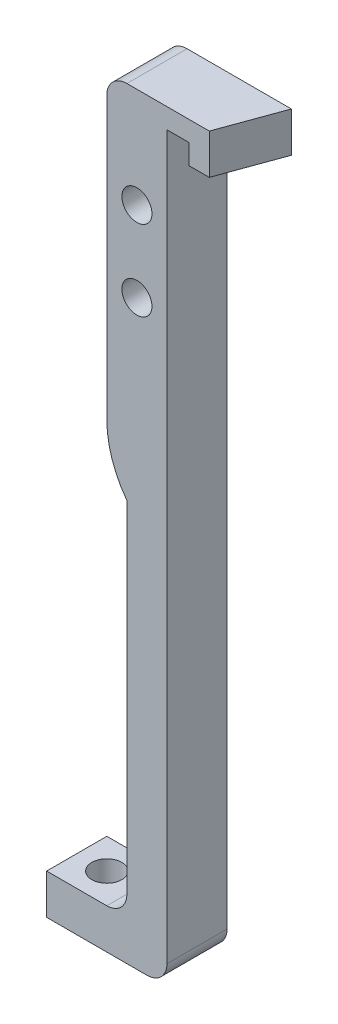
ISO-10303-21;
HEADER;
FILE_DESCRIPTION(('STEP AP214'),'2;1');
FILE_NAME('part.step','',(''),(''),'','','');
FILE_SCHEMA(('AUTOMOTIVE_DESIGN { 1 0 10303 214 1 1 1 1 }'));
ENDSEC;
DATA;
#1=APPLICATION_CONTEXT('core data for automotive mechanical design processes');
#2=APPLICATION_PROTOCOL_DEFINITION('international standard','automotive_design',2000,#1);
#3=PRODUCT_CONTEXT('',#1,'mechanical');
#4=PRODUCT('Part','Part','',(#3));
#5=PRODUCT_RELATED_PRODUCT_CATEGORY('part','',(#4));
#6=PRODUCT_DEFINITION_FORMATION('','',#4);
#7=PRODUCT_DEFINITION_CONTEXT('part definition',#1,'design');
#8=PRODUCT_DEFINITION('design','',#6,#7);
#9=PRODUCT_DEFINITION_SHAPE('','',#8);
#10=(LENGTH_UNIT() NAMED_UNIT(*) SI_UNIT(.MILLI.,.METRE.));
#11=(NAMED_UNIT(*) PLANE_ANGLE_UNIT() SI_UNIT($,.RADIAN.));
#12=(NAMED_UNIT(*) SI_UNIT($,.STERADIAN.) SOLID_ANGLE_UNIT());
#13=UNCERTAINTY_MEASURE_WITH_UNIT(LENGTH_MEASURE(1.E-05),#10,'distance_accuracy_value','');
#14=(GEOMETRIC_REPRESENTATION_CONTEXT(3) GLOBAL_UNCERTAINTY_ASSIGNED_CONTEXT((#13)) GLOBAL_UNIT_ASSIGNED_CONTEXT((#10,
#11,#12)) REPRESENTATION_CONTEXT('',''));
#15=CARTESIAN_POINT('',(0.,0.,0.));
#16=DIRECTION('',(0.,0.,1.));
#17=DIRECTION('',(1.,0.,0.));
#18=AXIS2_PLACEMENT_3D('',#15,#16,#17);
#19=CARTESIAN_POINT('',(15.748,93.98,-15.24));
#20=DIRECTION('',(0.,1.,0.));
#21=DIRECTION('',(0.,0.,-1.));
#22=AXIS2_PLACEMENT_3D('',#19,#20,#21);
#23=PLANE('',#22);
#24=DIRECTION('',(-0.342020143325663,0.,0.93969262078591));
#25=VECTOR('',#24,1.);
#26=CARTESIAN_POINT('',(10.4345468148915,93.98,-7.62));
#27=LINE('',#26,#25);
#28=CARTESIAN_POINT('',(13.2079999999999,93.98,-15.24));
#29=VERTEX_POINT('',#28);
#30=CARTESIAN_POINT('',(10.4345468148915,93.98,-7.62));
#31=VERTEX_POINT('',#30);
#32=EDGE_CURVE('E183',#29,#31,#27,.T.);
#33=ORIENTED_EDGE('',*,*,#32,.T.);
#34=DIRECTION('',(-1.,0.,0.));
#35=VECTOR('',#34,1.);
#36=CARTESIAN_POINT('',(15.748,93.98,-7.62));
#37=LINE('',#36,#35);
#38=CARTESIAN_POINT('',(7.62,93.98,-7.62));
#39=VERTEX_POINT('',#38);
#40=EDGE_CURVE('E207',#31,#39,#37,.T.);
#41=ORIENTED_EDGE('',*,*,#40,.T.);
#42=DIRECTION('',(0.,0.,1.));
#43=VECTOR('',#42,1.);
#44=CARTESIAN_POINT('',(7.62,93.98,-15.24));
#45=LINE('',#44,#43);
#46=CARTESIAN_POINT('',(7.62,93.9799999999999,-15.24));
#47=VERTEX_POINT('',#46);
#48=EDGE_CURVE('E203',#47,#39,#45,.T.);
#49=ORIENTED_EDGE('',*,*,#48,.F.);
#50=DIRECTION('',(-1.,0.,0.));
#51=VECTOR('',#50,1.);
#52=CARTESIAN_POINT('',(15.748,93.98,-15.24));
#53=LINE('',#52,#51);
#54=EDGE_CURVE('E225',#29,#47,#53,.T.);
#55=ORIENTED_EDGE('',*,*,#54,.F.);
#56=EDGE_LOOP('',(#33,#41,#49,#55));
#57=FACE_BOUND('',#56,.T.);
#58=ADVANCED_FACE('F35',(#57),#23,.F.);
#59=CARTESIAN_POINT('',(7.62,0.,-15.24));
#60=DIRECTION('',(-1.,0.,0.));
#61=DIRECTION('',(0.,0.,-1.));
#62=AXIS2_PLACEMENT_3D('',#59,#60,#61);
#63=PLANE('',#62);
#64=DIRECTION('',(0.,-1.,0.));
#65=VECTOR('',#64,1.);
#66=CARTESIAN_POINT('',(7.62,0.,-15.24));
#67=LINE('',#66,#65);
#68=CARTESIAN_POINT('',(7.62,2.54,-15.24));
#69=VERTEX_POINT('',#68);
#70=EDGE_CURVE('E216',#47,#69,#67,.T.);
#71=ORIENTED_EDGE('',*,*,#70,.F.);
#72=ORIENTED_EDGE('',*,*,#48,.T.);
#73=DIRECTION('',(0.,1.,0.));
#74=VECTOR('',#73,1.);
#75=CARTESIAN_POINT('',(7.62,0.,-7.62));
#76=LINE('',#75,#74);
#77=CARTESIAN_POINT('',(7.62,2.54,-7.62));
#78=VERTEX_POINT('',#77);
#79=EDGE_CURVE('E243',#78,#39,#76,.T.);
#80=ORIENTED_EDGE('',*,*,#79,.F.);
#81=DIRECTION('',(0.,0.,1.));
#82=VECTOR('',#81,1.);
#83=CARTESIAN_POINT('',(7.62,2.54,-15.24));
#84=LINE('',#83,#82);
#85=EDGE_CURVE('E166',#69,#78,#84,.T.);
#86=ORIENTED_EDGE('',*,*,#85,.F.);
#87=EDGE_LOOP('',(#71,#72,#80,#86));
#88=FACE_BOUND('',#87,.T.);
#89=ADVANCED_FACE('F313',(#88),#63,.F.);
#90=CARTESIAN_POINT('',(7.62,0.,-15.24));
#91=DIRECTION('',(0.,0.,1.));
#92=DIRECTION('',(-1.,0.,0.));
#93=AXIS2_PLACEMENT_3D('',#90,#91,#92);
#94=PLANE('',#93);
#95=CARTESIAN_POINT('',(3.81,73.66,-15.24));
#96=DIRECTION('',(0.,0.,1.));
#97=DIRECTION('',(1.,0.,0.));
#98=AXIS2_PLACEMENT_3D('',#95,#96,#97);
#99=CIRCLE('',#98,1.90500000000001);
#100=CARTESIAN_POINT('',(5.71500000000001,73.66,-15.24));
#101=VERTEX_POINT('',#100);
#102=EDGE_CURVE('E283',#101,#101,#99,.T.);
#103=ORIENTED_EDGE('',*,*,#102,.T.);
#104=EDGE_LOOP('',(#103));
#105=FACE_BOUND('',#104,.T.);
#106=CARTESIAN_POINT('',(3.81,83.82,-15.24));
#107=DIRECTION('',(0.,0.,1.));
#108=DIRECTION('',(1.,0.,0.));
#109=AXIS2_PLACEMENT_3D('',#106,#107,#108);
#110=CIRCLE('',#109,1.90500000000001);
#111=CARTESIAN_POINT('',(5.71500000000001,83.82,-15.24));
#112=VERTEX_POINT('',#111);
#113=EDGE_CURVE('E276',#112,#112,#110,.T.);
#114=ORIENTED_EDGE('',*,*,#113,.T.);
#115=EDGE_LOOP('',(#114));
#116=FACE_BOUND('',#115,.T.);
#117=DIRECTION('',(-1.,0.,0.));
#118=VECTOR('',#117,1.);
#119=CARTESIAN_POINT('',(7.62,0.,-15.24));
#120=LINE('',#119,#118);
#121=CARTESIAN_POINT('',(5.08,0.,-15.24));
#122=VERTEX_POINT('',#121);
#123=CARTESIAN_POINT('',(-7.62,0.,-15.24));
#124=VERTEX_POINT('',#123);
#125=EDGE_CURVE('E249',#122,#124,#120,.T.);
#126=ORIENTED_EDGE('',*,*,#125,.T.);
#127=DIRECTION('',(0.,1.,0.));
#128=VECTOR('',#127,1.);
#129=CARTESIAN_POINT('',(-7.62,0.,-15.24));
#130=LINE('',#129,#128);
#131=CARTESIAN_POINT('',(-7.62,5.08,-15.24));
#132=VERTEX_POINT('',#131);
#133=EDGE_CURVE('E210',#124,#132,#130,.T.);
#134=ORIENTED_EDGE('',*,*,#133,.T.);
#135=DIRECTION('',(1.,0.,0.));
#136=VECTOR('',#135,1.);
#137=CARTESIAN_POINT('',(-7.62,5.08,-15.24));
#138=LINE('',#137,#136);
#139=CARTESIAN_POINT('',(0.,5.08,-15.24));
#140=VERTEX_POINT('',#139);
#141=EDGE_CURVE('E253',#132,#140,#138,.T.);
#142=ORIENTED_EDGE('',*,*,#141,.T.);
#143=CARTESIAN_POINT('',(0.,7.62,-15.24));
#144=DIRECTION('',(0.,0.,-1.));
#145=DIRECTION('',(-1.,0.,0.));
#146=AXIS2_PLACEMENT_3D('',#143,#144,#145);
#147=CIRCLE('',#146,2.54);
#148=CARTESIAN_POINT('',(2.54,7.62,-15.24));
#149=VERTEX_POINT('',#148);
#150=EDGE_CURVE('E44',#149,#140,#147,.T.);
#151=ORIENTED_EDGE('',*,*,#150,.F.);
#152=DIRECTION('',(0.,1.,0.));
#153=VECTOR('',#152,1.);
#154=CARTESIAN_POINT('',(2.54,5.08,-15.24));
#155=LINE('',#154,#153);
#156=CARTESIAN_POINT('',(2.54,50.8,-15.24));
#157=VERTEX_POINT('',#156);
#158=EDGE_CURVE('E150',#149,#157,#155,.T.);
#159=ORIENTED_EDGE('',*,*,#158,.T.);
#160=CARTESIAN_POINT('',(12.7,58.42,-15.24));
#161=DIRECTION('',(0.,0.,-1.));
#162=DIRECTION('',(-1.,0.,0.));
#163=AXIS2_PLACEMENT_3D('',#160,#161,#162);
#164=CIRCLE('',#163,12.7);
#165=CARTESIAN_POINT('',(0.,58.42,-15.24));
#166=VERTEX_POINT('',#165);
#167=EDGE_CURVE('E160',#166,#157,#164,.F.);
#168=ORIENTED_EDGE('',*,*,#167,.F.);
#169=DIRECTION('',(0.,-1.,0.));
#170=VECTOR('',#169,1.);
#171=CARTESIAN_POINT('',(0.,0.,-15.24));
#172=LINE('',#171,#170);
#173=CARTESIAN_POINT('',(0.,93.98,-15.24));
#174=VERTEX_POINT('',#173);
#175=EDGE_CURVE('E232',#174,#166,#172,.T.);
#176=ORIENTED_EDGE('',*,*,#175,.F.);
#177=CARTESIAN_POINT('',(2.54,93.98,-15.24));
#178=DIRECTION('',(0.,0.,-1.));
#179=DIRECTION('',(-1.,0.,0.));
#180=AXIS2_PLACEMENT_3D('',#177,#178,#179);
#181=CIRCLE('',#180,2.54);
#182=CARTESIAN_POINT('',(2.54,96.52,-15.24));
#183=VERTEX_POINT('',#182);
#184=EDGE_CURVE('E265',#183,#174,#181,.F.);
#185=ORIENTED_EDGE('',*,*,#184,.F.);
#186=DIRECTION('',(-1.,0.,0.));
#187=VECTOR('',#186,1.);
#188=CARTESIAN_POINT('',(7.62,96.52,-15.24));
#189=LINE('',#188,#187);
#190=CARTESIAN_POINT('',(15.748,96.52,-15.24));
#191=VERTEX_POINT('',#190);
#192=EDGE_CURVE('E240',#191,#183,#189,.T.);
#193=ORIENTED_EDGE('',*,*,#192,.F.);
#194=DIRECTION('',(0.,-1.,0.));
#195=VECTOR('',#194,1.);
#196=CARTESIAN_POINT('',(15.748,96.52,-15.24));
#197=LINE('',#196,#195);
#198=CARTESIAN_POINT('',(15.748,91.44,-15.24));
#199=VERTEX_POINT('',#198);
#200=EDGE_CURVE('E204',#191,#199,#197,.T.);
#201=ORIENTED_EDGE('',*,*,#200,.T.);
#202=DIRECTION('',(-1.,0.,0.));
#203=VECTOR('',#202,1.);
#204=CARTESIAN_POINT('',(15.748,91.44,-15.24));
#205=LINE('',#204,#203);
#206=CARTESIAN_POINT('',(13.2079999999999,91.44,-15.24));
#207=VERTEX_POINT('',#206);
#208=EDGE_CURVE('E184',#199,#207,#205,.T.);
#209=ORIENTED_EDGE('',*,*,#208,.T.);
#210=DIRECTION('',(0.,1.,0.));
#211=VECTOR('',#210,1.);
#212=CARTESIAN_POINT('',(13.2079999999999,91.44,-15.24));
#213=LINE('',#212,#211);
#214=EDGE_CURVE('E201',#207,#29,#213,.T.);
#215=ORIENTED_EDGE('',*,*,#214,.T.);
#216=ORIENTED_EDGE('',*,*,#54,.T.);
#217=ORIENTED_EDGE('',*,*,#70,.T.);
#218=CARTESIAN_POINT('',(5.08,2.54,-15.24));
#219=DIRECTION('',(0.,0.,-1.));
#220=DIRECTION('',(-1.,0.,0.));
#221=AXIS2_PLACEMENT_3D('',#218,#219,#220);
#222=CIRCLE('',#221,2.54);
#223=EDGE_CURVE('E267',#122,#69,#222,.F.);
#224=ORIENTED_EDGE('',*,*,#223,.F.);
#225=EDGE_LOOP('',(#126,#134,#142,#151,#159,#168,#176,#185,#193,#201,#209,#215,#216,#217,#224));
#226=FACE_BOUND('',#225,.T.);
#227=ADVANCED_FACE('F169',(#105,#116,#226),#94,.F.);
#228=CARTESIAN_POINT('',(7.62,0.,-15.24));
#229=DIRECTION('',(0.,1.,0.));
#230=DIRECTION('',(0.,0.,-1.));
#231=AXIS2_PLACEMENT_3D('',#228,#229,#230);
#232=PLANE('',#231);
#233=CARTESIAN_POINT('',(-3.81,0.,-11.43));
#234=DIRECTION('',(0.,-1.,0.));
#235=DIRECTION('',(0.,0.,-1.));
#236=AXIS2_PLACEMENT_3D('',#233,#234,#235);
#237=CIRCLE('',#236,1.89865);
#238=CARTESIAN_POINT('',(-3.81,0.,-13.32865));
#239=VERTEX_POINT('',#238);
#240=EDGE_CURVE('E180',#239,#239,#237,.T.);
#241=ORIENTED_EDGE('',*,*,#240,.F.);
#242=EDGE_LOOP('',(#241));
#243=FACE_BOUND('',#242,.T.);
#244=DIRECTION('',(-1.,0.,0.));
#245=VECTOR('',#244,1.);
#246=CARTESIAN_POINT('',(7.62,0.,-7.62));
#247=LINE('',#246,#245);
#248=CARTESIAN_POINT('',(5.08,0.,-7.62));
#249=VERTEX_POINT('',#248);
#250=CARTESIAN_POINT('',(-7.62,0.,-7.62));
#251=VERTEX_POINT('',#250);
#252=EDGE_CURVE('E246',#249,#251,#247,.T.);
#253=ORIENTED_EDGE('',*,*,#252,.T.);
#254=DIRECTION('',(0.,0.,-1.));
#255=VECTOR('',#254,1.);
#256=CARTESIAN_POINT('',(-7.62,0.,-15.24));
#257=LINE('',#256,#255);
#258=EDGE_CURVE('E254',#251,#124,#257,.T.);
#259=ORIENTED_EDGE('',*,*,#258,.T.);
#260=ORIENTED_EDGE('',*,*,#125,.F.);
#261=DIRECTION('',(0.,0.,1.));
#262=VECTOR('',#261,1.);
#263=CARTESIAN_POINT('',(5.08,0.,-15.24));
#264=LINE('',#263,#262);
#265=EDGE_CURVE('E263',#249,#122,#264,.F.);
#266=ORIENTED_EDGE('',*,*,#265,.F.);
#267=EDGE_LOOP('',(#253,#259,#260,#266));
#268=FACE_BOUND('',#267,.T.);
#269=ADVANCED_FACE('F300',(#243,#268),#232,.F.);
#270=CARTESIAN_POINT('',(7.62,0.,-7.62));
#271=DIRECTION('',(0.,0.,-1.));
#272=DIRECTION('',(1.,0.,0.));
#273=AXIS2_PLACEMENT_3D('',#270,#271,#272);
#274=PLANE('',#273);
#275=CARTESIAN_POINT('',(3.81,73.66,-7.62));
#276=DIRECTION('',(0.,0.,1.));
#277=DIRECTION('',(1.,0.,0.));
#278=AXIS2_PLACEMENT_3D('',#275,#276,#277);
#279=CIRCLE('',#278,1.90500000000001);
#280=CARTESIAN_POINT('',(5.71500000000001,73.66,-7.62));
#281=VERTEX_POINT('',#280);
#282=EDGE_CURVE('E39',#281,#281,#279,.T.);
#283=ORIENTED_EDGE('',*,*,#282,.F.);
#284=EDGE_LOOP('',(#283));
#285=FACE_BOUND('',#284,.T.);
#286=CARTESIAN_POINT('',(3.81,83.82,-7.62));
#287=DIRECTION('',(0.,0.,1.));
#288=DIRECTION('',(1.,0.,0.));
#289=AXIS2_PLACEMENT_3D('',#286,#287,#288);
#290=CIRCLE('',#289,1.90500000000001);
#291=CARTESIAN_POINT('',(5.71500000000001,83.82,-7.62));
#292=VERTEX_POINT('',#291);
#293=EDGE_CURVE('E172',#292,#292,#290,.T.);
#294=ORIENTED_EDGE('',*,*,#293,.F.);
#295=EDGE_LOOP('',(#294));
#296=FACE_BOUND('',#295,.T.);
#297=ORIENTED_EDGE('',*,*,#79,.T.);
#298=ORIENTED_EDGE('',*,*,#40,.F.);
#299=DIRECTION('',(0.,1.,0.));
#300=VECTOR('',#299,1.);
#301=CARTESIAN_POINT('',(10.4345468148915,91.44,-7.62));
#302=LINE('',#301,#300);
#303=CARTESIAN_POINT('',(10.4345468148915,91.44,-7.62));
#304=VERTEX_POINT('',#303);
#305=EDGE_CURVE('E199',#304,#31,#302,.T.);
#306=ORIENTED_EDGE('',*,*,#305,.F.);
#307=DIRECTION('',(1.,0.,0.));
#308=VECTOR('',#307,1.);
#309=CARTESIAN_POINT('',(10.4345468148915,91.44,-7.62));
#310=LINE('',#309,#308);
#311=CARTESIAN_POINT('',(12.9745468148915,91.44,-7.62));
#312=VERTEX_POINT('',#311);
#313=EDGE_CURVE('E189',#304,#312,#310,.T.);
#314=ORIENTED_EDGE('',*,*,#313,.T.);
#315=DIRECTION('',(0.,1.,0.));
#316=VECTOR('',#315,1.);
#317=CARTESIAN_POINT('',(12.9745468148915,91.44,-7.62));
#318=LINE('',#317,#316);
#319=CARTESIAN_POINT('',(12.9745468148915,96.52,-7.62));
#320=VERTEX_POINT('',#319);
#321=EDGE_CURVE('E194',#312,#320,#318,.T.);
#322=ORIENTED_EDGE('',*,*,#321,.T.);
#323=DIRECTION('',(-1.,0.,0.));
#324=VECTOR('',#323,1.);
#325=CARTESIAN_POINT('',(7.62,96.52,-7.62));
#326=LINE('',#325,#324);
#327=CARTESIAN_POINT('',(2.54,96.52,-7.62));
#328=VERTEX_POINT('',#327);
#329=EDGE_CURVE('E242',#320,#328,#326,.T.);
#330=ORIENTED_EDGE('',*,*,#329,.T.);
#331=CARTESIAN_POINT('',(2.54,93.98,-7.62));
#332=DIRECTION('',(0.,0.,1.));
#333=DIRECTION('',(1.,0.,0.));
#334=AXIS2_PLACEMENT_3D('',#331,#332,#333);
#335=CIRCLE('',#334,2.54);
#336=CARTESIAN_POINT('',(0.,93.98,-7.62));
#337=VERTEX_POINT('',#336);
#338=EDGE_CURVE('E334',#337,#328,#335,.F.);
#339=ORIENTED_EDGE('',*,*,#338,.F.);
#340=DIRECTION('',(0.,1.,0.));
#341=VECTOR('',#340,1.);
#342=CARTESIAN_POINT('',(0.,0.,-7.62));
#343=LINE('',#342,#341);
#344=CARTESIAN_POINT('',(0.,58.42,-7.62));
#345=VERTEX_POINT('',#344);
#346=EDGE_CURVE('E228',#345,#337,#343,.T.);
#347=ORIENTED_EDGE('',*,*,#346,.F.);
#348=CARTESIAN_POINT('',(12.7,58.42,-7.62));
#349=DIRECTION('',(0.,0.,1.));
#350=DIRECTION('',(1.,0.,0.));
#351=AXIS2_PLACEMENT_3D('',#348,#349,#350);
#352=CIRCLE('',#351,12.7);
#353=CARTESIAN_POINT('',(2.54,50.8,-7.62));
#354=VERTEX_POINT('',#353);
#355=EDGE_CURVE('E233',#354,#345,#352,.F.);
#356=ORIENTED_EDGE('',*,*,#355,.F.);
#357=DIRECTION('',(0.,-1.,0.));
#358=VECTOR('',#357,1.);
#359=CARTESIAN_POINT('',(2.54,5.08,-7.62));
#360=LINE('',#359,#358);
#361=CARTESIAN_POINT('',(2.54,7.62,-7.62));
#362=VERTEX_POINT('',#361);
#363=EDGE_CURVE('E153',#354,#362,#360,.T.);
#364=ORIENTED_EDGE('',*,*,#363,.T.);
#365=CARTESIAN_POINT('',(0.,7.62,-7.62));
#366=DIRECTION('',(0.,0.,1.));
#367=DIRECTION('',(1.,0.,0.));
#368=AXIS2_PLACEMENT_3D('',#365,#366,#367);
#369=CIRCLE('',#368,2.54);
#370=CARTESIAN_POINT('',(0.,5.08,-7.62));
#371=VERTEX_POINT('',#370);
#372=EDGE_CURVE('E11',#371,#362,#369,.T.);
#373=ORIENTED_EDGE('',*,*,#372,.F.);
#374=DIRECTION('',(1.,0.,0.));
#375=VECTOR('',#374,1.);
#376=CARTESIAN_POINT('',(-7.62,5.08,-7.62));
#377=LINE('',#376,#375);
#378=CARTESIAN_POINT('',(-7.62,5.08,-7.62));
#379=VERTEX_POINT('',#378);
#380=EDGE_CURVE('E251',#379,#371,#377,.T.);
#381=ORIENTED_EDGE('',*,*,#380,.F.);
#382=DIRECTION('',(0.,-1.,0.));
#383=VECTOR('',#382,1.);
#384=CARTESIAN_POINT('',(-7.62,0.,-7.62));
#385=LINE('',#384,#383);
#386=EDGE_CURVE('E341',#379,#251,#385,.T.);
#387=ORIENTED_EDGE('',*,*,#386,.T.);
#388=ORIENTED_EDGE('',*,*,#252,.F.);
#389=CARTESIAN_POINT('',(5.08,2.54,-7.62));
#390=DIRECTION('',(0.,0.,1.));
#391=DIRECTION('',(1.,0.,0.));
#392=AXIS2_PLACEMENT_3D('',#389,#390,#391);
#393=CIRCLE('',#392,2.54);
#394=EDGE_CURVE('E307',#78,#249,#393,.F.);
#395=ORIENTED_EDGE('',*,*,#394,.F.);
#396=EDGE_LOOP('',(#297,#298,#306,#314,#322,#330,#339,#347,#356,#364,#373,#381,#387,#388,#395));
#397=FACE_BOUND('',#396,.T.);
#398=ADVANCED_FACE('F296',(#285,#296,#397),#274,.F.);
#399=CARTESIAN_POINT('',(7.62,96.52,-15.24));
#400=DIRECTION('',(0.,-1.,0.));
#401=DIRECTION('',(0.,0.,1.));
#402=AXIS2_PLACEMENT_3D('',#399,#400,#401);
#403=PLANE('',#402);
#404=ORIENTED_EDGE('',*,*,#329,.F.);
#405=DIRECTION('',(-0.342020143325669,0.,0.939692620785908));
#406=VECTOR('',#405,1.);
#407=CARTESIAN_POINT('',(12.9745468148915,96.52,-7.62));
#408=LINE('',#407,#406);
#409=EDGE_CURVE('E157',#191,#320,#408,.T.);
#410=ORIENTED_EDGE('',*,*,#409,.F.);
#411=ORIENTED_EDGE('',*,*,#192,.T.);
#412=DIRECTION('',(0.,0.,-1.));
#413=VECTOR('',#412,1.);
#414=CARTESIAN_POINT('',(2.54,96.52,-15.24));
#415=LINE('',#414,#413);
#416=EDGE_CURVE('E52',#328,#183,#415,.T.);
#417=ORIENTED_EDGE('',*,*,#416,.F.);
#418=EDGE_LOOP('',(#404,#410,#411,#417));
#419=FACE_BOUND('',#418,.T.);
#420=ADVANCED_FACE('F299',(#419),#403,.F.);
#421=CARTESIAN_POINT('',(0.,0.,-15.24));
#422=DIRECTION('',(-1.,0.,0.));
#423=DIRECTION('',(0.,0.,-1.));
#424=AXIS2_PLACEMENT_3D('',#421,#422,#423);
#425=PLANE('',#424);
#426=ORIENTED_EDGE('',*,*,#175,.T.);
#427=DIRECTION('',(0.,0.,-1.));
#428=VECTOR('',#427,1.);
#429=CARTESIAN_POINT('',(0.,58.42,-15.24));
#430=LINE('',#429,#428);
#431=EDGE_CURVE('E162',#345,#166,#430,.T.);
#432=ORIENTED_EDGE('',*,*,#431,.F.);
#433=ORIENTED_EDGE('',*,*,#346,.T.);
#434=DIRECTION('',(0.,0.,-1.));
#435=VECTOR('',#434,1.);
#436=CARTESIAN_POINT('',(0.,93.98,-7.62));
#437=LINE('',#436,#435);
#438=EDGE_CURVE('E270',#174,#337,#437,.F.);
#439=ORIENTED_EDGE('',*,*,#438,.F.);
#440=EDGE_LOOP('',(#426,#432,#433,#439));
#441=FACE_BOUND('',#440,.T.);
#442=ADVANCED_FACE('F353',(#441),#425,.T.);
#443=CARTESIAN_POINT('',(-7.62,5.08,-15.24));
#444=DIRECTION('',(0.,-1.,0.));
#445=DIRECTION('',(0.,0.,1.));
#446=AXIS2_PLACEMENT_3D('',#443,#444,#445);
#447=PLANE('',#446);
#448=CARTESIAN_POINT('',(-3.81,5.08,-11.43));
#449=DIRECTION('',(0.,-1.,0.));
#450=DIRECTION('',(0.,0.,-1.));
#451=AXIS2_PLACEMENT_3D('',#448,#449,#450);
#452=CIRCLE('',#451,1.89865);
#453=CARTESIAN_POINT('',(-3.81,5.08,-13.32865));
#454=VERTEX_POINT('',#453);
#455=EDGE_CURVE('E177',#454,#454,#452,.T.);
#456=ORIENTED_EDGE('',*,*,#455,.T.);
#457=EDGE_LOOP('',(#456));
#458=FACE_BOUND('',#457,.T.);
#459=ORIENTED_EDGE('',*,*,#141,.F.);
#460=DIRECTION('',(0.,0.,1.));
#461=VECTOR('',#460,1.);
#462=CARTESIAN_POINT('',(-7.62,5.08,-15.24));
#463=LINE('',#462,#461);
#464=EDGE_CURVE('E342',#132,#379,#463,.T.);
#465=ORIENTED_EDGE('',*,*,#464,.T.);
#466=ORIENTED_EDGE('',*,*,#380,.T.);
#467=DIRECTION('',(0.,0.,-1.));
#468=VECTOR('',#467,1.);
#469=CARTESIAN_POINT('',(0.,5.08,-7.62));
#470=LINE('',#469,#468);
#471=EDGE_CURVE('E60',#140,#371,#470,.F.);
#472=ORIENTED_EDGE('',*,*,#471,.F.);
#473=EDGE_LOOP('',(#459,#465,#466,#472));
#474=FACE_BOUND('',#473,.T.);
#475=ADVANCED_FACE('F351',(#458,#474),#447,.F.);
#476=CARTESIAN_POINT('',(-7.62,0.,-15.24));
#477=DIRECTION('',(-1.,0.,0.));
#478=DIRECTION('',(0.,0.,-1.));
#479=AXIS2_PLACEMENT_3D('',#476,#477,#478);
#480=PLANE('',#479);
#481=ORIENTED_EDGE('',*,*,#133,.F.);
#482=ORIENTED_EDGE('',*,*,#258,.F.);
#483=ORIENTED_EDGE('',*,*,#386,.F.);
#484=ORIENTED_EDGE('',*,*,#464,.F.);
#485=EDGE_LOOP('',(#481,#482,#483,#484));
#486=FACE_BOUND('',#485,.T.);
#487=ADVANCED_FACE('F349',(#486),#480,.T.);
#488=CARTESIAN_POINT('',(10.4345468148915,91.44,-7.62));
#489=DIRECTION('',(0.939692620785911,0.,0.342020143325663));
#490=DIRECTION('',(-0.342020143325663,0.,0.939692620785911));
#491=AXIS2_PLACEMENT_3D('',#488,#489,#490);
#492=PLANE('',#491);
#493=ORIENTED_EDGE('',*,*,#32,.F.);
#494=ORIENTED_EDGE('',*,*,#214,.F.);
#495=DIRECTION('',(-0.342020143325663,0.,0.93969262078591));
#496=VECTOR('',#495,1.);
#497=CARTESIAN_POINT('',(10.4345468148915,91.44,-7.62));
#498=LINE('',#497,#496);
#499=EDGE_CURVE('E187',#207,#304,#498,.T.);
#500=ORIENTED_EDGE('',*,*,#499,.T.);
#501=ORIENTED_EDGE('',*,*,#305,.T.);
#502=EDGE_LOOP('',(#493,#494,#500,#501));
#503=FACE_BOUND('',#502,.T.);
#504=ADVANCED_FACE('F320',(#503),#492,.F.);
#505=CARTESIAN_POINT('',(15.748,91.44,-15.24));
#506=DIRECTION('',(-0.939692620785908,0.,-0.342020143325669));
#507=DIRECTION('',(0.342020143325669,0.,-0.939692620785908));
#508=AXIS2_PLACEMENT_3D('',#505,#506,#507);
#509=PLANE('',#508);
#510=ORIENTED_EDGE('',*,*,#321,.F.);
#511=DIRECTION('',(0.342020143325669,0.,-0.939692620785908));
#512=VECTOR('',#511,1.);
#513=CARTESIAN_POINT('',(15.748,91.44,-15.24));
#514=LINE('',#513,#512);
#515=EDGE_CURVE('E192',#312,#199,#514,.T.);
#516=ORIENTED_EDGE('',*,*,#515,.T.);
#517=ORIENTED_EDGE('',*,*,#200,.F.);
#518=ORIENTED_EDGE('',*,*,#409,.T.);
#519=EDGE_LOOP('',(#510,#516,#517,#518));
#520=FACE_BOUND('',#519,.T.);
#521=ADVANCED_FACE('F328',(#520),#509,.F.);
#522=CARTESIAN_POINT('',(0.,91.44,-15.24));
#523=DIRECTION('',(0.,1.,0.));
#524=DIRECTION('',(0.,0.,-1.));
#525=AXIS2_PLACEMENT_3D('',#522,#523,#524);
#526=PLANE('',#525);
#527=ORIENTED_EDGE('',*,*,#208,.F.);
#528=ORIENTED_EDGE('',*,*,#515,.F.);
#529=ORIENTED_EDGE('',*,*,#313,.F.);
#530=ORIENTED_EDGE('',*,*,#499,.F.);
#531=EDGE_LOOP('',(#527,#528,#529,#530));
#532=FACE_BOUND('',#531,.T.);
#533=ADVANCED_FACE('F325',(#532),#526,.F.);
#534=CARTESIAN_POINT('',(-3.81,5.08,-11.43));
#535=DIRECTION('',(0.,1.,0.));
#536=DIRECTION('',(0.,0.,-1.));
#537=AXIS2_PLACEMENT_3D('',#534,#535,#536);
#538=CYLINDRICAL_SURFACE('',#537,1.89865);
#539=ORIENTED_EDGE('',*,*,#240,.T.);
#540=EDGE_LOOP('',(#539));
#541=FACE_BOUND('',#540,.T.);
#542=ORIENTED_EDGE('',*,*,#455,.F.);
#543=EDGE_LOOP('',(#542));
#544=FACE_BOUND('',#543,.T.);
#545=ADVANCED_FACE('F375',(#541,#544),#538,.F.);
#546=CARTESIAN_POINT('',(2.54,0.,-15.24));
#547=DIRECTION('',(1.,0.,0.));
#548=DIRECTION('',(0.,0.,1.));
#549=AXIS2_PLACEMENT_3D('',#546,#547,#548);
#550=PLANE('',#549);
#551=ORIENTED_EDGE('',*,*,#363,.F.);
#552=DIRECTION('',(0.,0.,1.));
#553=VECTOR('',#552,1.);
#554=CARTESIAN_POINT('',(2.54,50.8,-7.62));
#555=LINE('',#554,#553);
#556=EDGE_CURVE('E146',#157,#354,#555,.T.);
#557=ORIENTED_EDGE('',*,*,#556,.F.);
#558=ORIENTED_EDGE('',*,*,#158,.F.);
#559=DIRECTION('',(0.,0.,-1.));
#560=VECTOR('',#559,1.);
#561=CARTESIAN_POINT('',(2.54,7.62,-15.24));
#562=LINE('',#561,#560);
#563=EDGE_CURVE('E272',#362,#149,#562,.T.);
#564=ORIENTED_EDGE('',*,*,#563,.F.);
#565=EDGE_LOOP('',(#551,#557,#558,#564));
#566=FACE_BOUND('',#565,.T.);
#567=ADVANCED_FACE('F148',(#566),#550,.F.);
#568=CARTESIAN_POINT('',(12.7,58.42,-7.62));
#569=DIRECTION('',(0.,0.,1.));
#570=DIRECTION('',(-1.,0.,0.));
#571=AXIS2_PLACEMENT_3D('',#568,#569,#570);
#572=CYLINDRICAL_SURFACE('',#571,12.7);
#573=ORIENTED_EDGE('',*,*,#167,.T.);
#574=ORIENTED_EDGE('',*,*,#556,.T.);
#575=ORIENTED_EDGE('',*,*,#355,.T.);
#576=ORIENTED_EDGE('',*,*,#431,.T.);
#577=EDGE_LOOP('',(#573,#574,#575,#576));
#578=FACE_BOUND('',#577,.T.);
#579=ADVANCED_FACE('F161',(#578),#572,.T.);
#580=CARTESIAN_POINT('',(5.08,2.54,-15.24));
#581=DIRECTION('',(0.,0.,1.));
#582=DIRECTION('',(-1.,0.,0.));
#583=AXIS2_PLACEMENT_3D('',#580,#581,#582);
#584=CYLINDRICAL_SURFACE('',#583,2.54);
#585=ORIENTED_EDGE('',*,*,#223,.T.);
#586=ORIENTED_EDGE('',*,*,#85,.T.);
#587=ORIENTED_EDGE('',*,*,#394,.T.);
#588=ORIENTED_EDGE('',*,*,#265,.T.);
#589=EDGE_LOOP('',(#585,#586,#587,#588));
#590=FACE_BOUND('',#589,.T.);
#591=ADVANCED_FACE('F391',(#590),#584,.T.);
#592=CARTESIAN_POINT('',(2.54,93.98,-15.24));
#593=DIRECTION('',(0.,0.,1.));
#594=DIRECTION('',(-1.,0.,0.));
#595=AXIS2_PLACEMENT_3D('',#592,#593,#594);
#596=CYLINDRICAL_SURFACE('',#595,2.54);
#597=ORIENTED_EDGE('',*,*,#338,.T.);
#598=ORIENTED_EDGE('',*,*,#416,.T.);
#599=ORIENTED_EDGE('',*,*,#184,.T.);
#600=ORIENTED_EDGE('',*,*,#438,.T.);
#601=EDGE_LOOP('',(#597,#598,#599,#600));
#602=FACE_BOUND('',#601,.T.);
#603=ADVANCED_FACE('F386',(#602),#596,.T.);
#604=CARTESIAN_POINT('',(0.,7.62,-15.24));
#605=DIRECTION('',(0.,0.,1.));
#606=DIRECTION('',(0.,1.,0.));
#607=AXIS2_PLACEMENT_3D('',#604,#605,#606);
#608=CYLINDRICAL_SURFACE('',#607,2.54);
#609=ORIENTED_EDGE('',*,*,#372,.T.);
#610=ORIENTED_EDGE('',*,*,#563,.T.);
#611=ORIENTED_EDGE('',*,*,#150,.T.);
#612=ORIENTED_EDGE('',*,*,#471,.T.);
#613=EDGE_LOOP('',(#609,#610,#611,#612));
#614=FACE_BOUND('',#613,.T.);
#615=ADVANCED_FACE('F37',(#614),#608,.F.);
#616=CARTESIAN_POINT('',(3.81,83.82,-7.61995));
#617=DIRECTION('',(0.,0.,-1.));
#618=DIRECTION('',(1.,0.,0.));
#619=AXIS2_PLACEMENT_3D('',#616,#617,#618);
#620=CYLINDRICAL_SURFACE('',#619,1.90500000000001);
#621=ORIENTED_EDGE('',*,*,#113,.F.);
#622=EDGE_LOOP('',(#621));
#623=FACE_BOUND('',#622,.T.);
#624=ORIENTED_EDGE('',*,*,#293,.T.);
#625=EDGE_LOOP('',(#624));
#626=FACE_BOUND('',#625,.T.);
#627=ADVANCED_FACE('F292',(#623,#626),#620,.F.);
#628=CARTESIAN_POINT('',(3.81,73.66,-7.61995));
#629=DIRECTION('',(0.,0.,-1.));
#630=DIRECTION('',(1.,0.,0.));
#631=AXIS2_PLACEMENT_3D('',#628,#629,#630);
#632=CYLINDRICAL_SURFACE('',#631,1.90500000000001);
#633=ORIENTED_EDGE('',*,*,#102,.F.);
#634=EDGE_LOOP('',(#633));
#635=FACE_BOUND('',#634,.T.);
#636=ORIENTED_EDGE('',*,*,#282,.T.);
#637=EDGE_LOOP('',(#636));
#638=FACE_BOUND('',#637,.T.);
#639=ADVANCED_FACE('F289',(#635,#638),#632,.F.);
#640=CLOSED_SHELL('',(#58,#89,#227,#269,#398,#420,#442,#475,#487,#504,#521,#533,#545,#567,#579,
#591,#603,#615,#627,#639));
#641=MANIFOLD_SOLID_BREP('B2',#640);
#642=ADVANCED_BREP_SHAPE_REPRESENTATION('',(#18,#641),#14);
#643=SHAPE_DEFINITION_REPRESENTATION(#9,#642);
ENDSEC;
END-ISO-10303-21;
